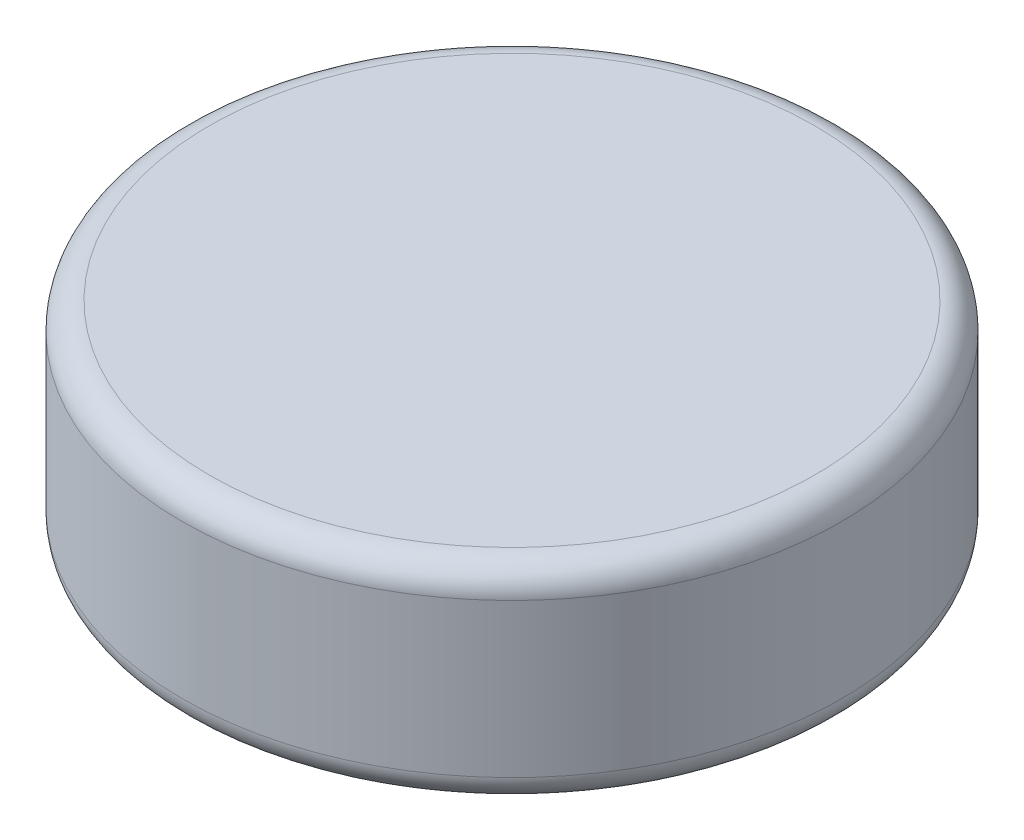
ISO-10303-21;
HEADER;
FILE_DESCRIPTION(('STEP AP214'),'2;1');
FILE_NAME('part.step','',(''),(''),'','','');
FILE_SCHEMA(('AUTOMOTIVE_DESIGN { 1 0 10303 214 1 1 1 1 }'));
ENDSEC;
DATA;
#1=APPLICATION_CONTEXT('core data for automotive mechanical design processes');
#2=APPLICATION_PROTOCOL_DEFINITION('international standard','automotive_design',2000,#1);
#3=PRODUCT_CONTEXT('',#1,'mechanical');
#4=PRODUCT('Part','Part','',(#3));
#5=PRODUCT_RELATED_PRODUCT_CATEGORY('part','',(#4));
#6=PRODUCT_DEFINITION_FORMATION('','',#4);
#7=PRODUCT_DEFINITION_CONTEXT('part definition',#1,'design');
#8=PRODUCT_DEFINITION('design','',#6,#7);
#9=PRODUCT_DEFINITION_SHAPE('','',#8);
#10=(LENGTH_UNIT() NAMED_UNIT(*) SI_UNIT(.MILLI.,.METRE.));
#11=(NAMED_UNIT(*) PLANE_ANGLE_UNIT() SI_UNIT($,.RADIAN.));
#12=(NAMED_UNIT(*) SI_UNIT($,.STERADIAN.) SOLID_ANGLE_UNIT());
#13=UNCERTAINTY_MEASURE_WITH_UNIT(LENGTH_MEASURE(1.E-05),#10,'distance_accuracy_value','');
#14=(GEOMETRIC_REPRESENTATION_CONTEXT(3) GLOBAL_UNCERTAINTY_ASSIGNED_CONTEXT((#13)) GLOBAL_UNIT_ASSIGNED_CONTEXT((#10,
#11,#12)) REPRESENTATION_CONTEXT('',''));
#15=CARTESIAN_POINT('',(0.,0.,0.));
#16=DIRECTION('',(0.,0.,1.));
#17=DIRECTION('',(1.,0.,0.));
#18=AXIS2_PLACEMENT_3D('',#15,#16,#17);
#19=CARTESIAN_POINT('',(0.,7.7,0.));
#20=DIRECTION('',(0.,-1.,0.));
#21=DIRECTION('',(0.,0.,-1.));
#22=AXIS2_PLACEMENT_3D('',#19,#20,#21);
#23=CYLINDRICAL_SURFACE('',#22,12.25);
#24=CARTESIAN_POINT('',(0.,1.,0.));
#25=DIRECTION('',(0.,1.,0.));
#26=DIRECTION('',(0.,0.,1.));
#27=AXIS2_PLACEMENT_3D('',#24,#25,#26);
#28=CIRCLE('',#27,12.25);
#29=CARTESIAN_POINT('',(0.,0.999999999999997,-12.25));
#30=VERTEX_POINT('',#29);
#31=EDGE_CURVE('E43',#30,#30,#28,.T.);
#32=CARTESIAN_POINT('',(0.,6.7,0.));
#33=DIRECTION('',(0.,1.,0.));
#34=DIRECTION('',(0.,0.,1.));
#35=AXIS2_PLACEMENT_3D('',#32,#33,#34);
#36=CIRCLE('',#35,12.25);
#37=CARTESIAN_POINT('',(0.,6.7,-12.25));
#38=VERTEX_POINT('',#37);
#39=EDGE_CURVE('E47',#38,#38,#36,.F.);
#40=CARTESIAN_POINT('',(0.,0.999999999999997,-12.25));
#41=CARTESIAN_POINT('',(0.,1.059375,-12.25));
#42=CARTESIAN_POINT('',(0.,1.11875,-12.25));
#43=CARTESIAN_POINT('',(0.,1.2375,-12.25));
#44=CARTESIAN_POINT('',(0.,1.296875,-12.25));
#45=CARTESIAN_POINT('',(0.,1.415625,-12.25));
#46=CARTESIAN_POINT('',(0.,1.475,-12.25));
#47=CARTESIAN_POINT('',(0.,1.59375,-12.25));
#48=CARTESIAN_POINT('',(0.,1.653125,-12.25));
#49=CARTESIAN_POINT('',(0.,1.771875,-12.25));
#50=CARTESIAN_POINT('',(0.,1.83125,-12.25));
#51=CARTESIAN_POINT('',(0.,1.95,-12.25));
#52=CARTESIAN_POINT('',(0.,2.009375,-12.25));
#53=CARTESIAN_POINT('',(0.,2.128125,-12.25));
#54=CARTESIAN_POINT('',(0.,2.1875,-12.25));
#55=CARTESIAN_POINT('',(0.,2.30625,-12.25));
#56=CARTESIAN_POINT('',(0.,2.365625,-12.25));
#57=CARTESIAN_POINT('',(0.,2.484375,-12.25));
#58=CARTESIAN_POINT('',(0.,2.54375,-12.25));
#59=CARTESIAN_POINT('',(0.,2.6625,-12.25));
#60=CARTESIAN_POINT('',(0.,2.721875,-12.25));
#61=CARTESIAN_POINT('',(0.,2.840625,-12.25));
#62=CARTESIAN_POINT('',(0.,2.9,-12.25));
#63=CARTESIAN_POINT('',(0.,3.01875,-12.25));
#64=CARTESIAN_POINT('',(0.,3.078125,-12.25));
#65=CARTESIAN_POINT('',(0.,3.196875,-12.25));
#66=CARTESIAN_POINT('',(0.,3.25625,-12.25));
#67=CARTESIAN_POINT('',(0.,3.375,-12.25));
#68=CARTESIAN_POINT('',(0.,3.434375,-12.25));
#69=CARTESIAN_POINT('',(0.,3.553125,-12.25));
#70=CARTESIAN_POINT('',(0.,3.6125,-12.25));
#71=CARTESIAN_POINT('',(0.,3.73125,-12.25));
#72=CARTESIAN_POINT('',(0.,3.790625,-12.25));
#73=CARTESIAN_POINT('',(0.,3.909375,-12.25));
#74=CARTESIAN_POINT('',(0.,3.96875,-12.25));
#75=CARTESIAN_POINT('',(0.,4.0875,-12.25));
#76=CARTESIAN_POINT('',(0.,4.146875,-12.25));
#77=CARTESIAN_POINT('',(0.,4.265625,-12.25));
#78=CARTESIAN_POINT('',(0.,4.325,-12.25));
#79=CARTESIAN_POINT('',(0.,4.44375,-12.25));
#80=CARTESIAN_POINT('',(0.,4.503125,-12.25));
#81=CARTESIAN_POINT('',(0.,4.621875,-12.25));
#82=CARTESIAN_POINT('',(0.,4.68125,-12.25));
#83=CARTESIAN_POINT('',(0.,4.8,-12.25));
#84=CARTESIAN_POINT('',(0.,4.859375,-12.25));
#85=CARTESIAN_POINT('',(0.,4.978125,-12.25));
#86=CARTESIAN_POINT('',(0.,5.0375,-12.25));
#87=CARTESIAN_POINT('',(0.,5.15625,-12.25));
#88=CARTESIAN_POINT('',(0.,5.215625,-12.25));
#89=CARTESIAN_POINT('',(0.,5.334375,-12.25));
#90=CARTESIAN_POINT('',(0.,5.39375,-12.25));
#91=CARTESIAN_POINT('',(0.,5.5125,-12.25));
#92=CARTESIAN_POINT('',(0.,5.571875,-12.25));
#93=CARTESIAN_POINT('',(0.,5.690625,-12.25));
#94=CARTESIAN_POINT('',(0.,5.75,-12.25));
#95=CARTESIAN_POINT('',(0.,5.86875,-12.25));
#96=CARTESIAN_POINT('',(0.,5.928125,-12.25));
#97=CARTESIAN_POINT('',(0.,6.046875,-12.25));
#98=CARTESIAN_POINT('',(0.,6.10625,-12.25));
#99=CARTESIAN_POINT('',(0.,6.225,-12.25));
#100=CARTESIAN_POINT('',(0.,6.284375,-12.25));
#101=CARTESIAN_POINT('',(0.,6.403125,-12.25));
#102=CARTESIAN_POINT('',(0.,6.4625,-12.25));
#103=CARTESIAN_POINT('',(0.,6.58125,-12.25));
#104=CARTESIAN_POINT('',(0.,6.640625,-12.25));
#105=CARTESIAN_POINT('',(0.,6.7,-12.25));
#106=B_SPLINE_CURVE_WITH_KNOTS('',3,(#40,#41,#42,#43,#44,#45,#46,#47,#48,#49,#50,#51,#52,#53,
#54,#55,#56,#57,#58,#59,#60,#61,#62,#63,#64,#65,#66,#67,#68,#69,#70,#71,#72,#73,#74,#75,#76,#77,
#78,#79,#80,#81,#82,#83,#84,#85,#86,#87,#88,#89,#90,#91,#92,#93,#94,#95,#96,#97,#98,#99,#100,
#101,#102,#103,#104,#105),.UNSPECIFIED.,.F.,.F.,(4,2,2,2,2,2,2,2,2,2,2,2,2,2,2,2,2,2,2,2,2,2,2,
2,2,2,2,2,2,2,2,2,4),(0.,0.178125,0.35625,0.534375,0.7125,0.890625,1.06875,1.246875,1.425,
1.603125,1.78125,1.959375,2.1375,2.315625,2.49375,2.671875,2.85,3.028125,3.20625,3.384375,
3.5625,3.740625,3.91875,4.096875,4.275,4.453125,4.63125,4.809375,4.9875,5.165625,5.34375,
5.521875,5.7),.UNSPECIFIED.);
#107=EDGE_CURVE('BSEAM32',#30,#38,#106,.T.);
#108=ORIENTED_EDGE('',*,*,#31,.T.);
#109=ORIENTED_EDGE('',*,*,#39,.T.);
#110=ORIENTED_EDGE('',*,*,#107,.T.);
#111=ORIENTED_EDGE('',*,*,#107,.F.);
#112=EDGE_LOOP('',(#108,#110,#109,#111));
#113=FACE_BOUND('',#112,.T.);
#114=ADVANCED_FACE('F32',(#113),#23,.T.);
#115=CARTESIAN_POINT('',(0.,7.7,0.));
#116=DIRECTION('',(0.,1.,0.));
#117=DIRECTION('',(0.,0.,1.));
#118=AXIS2_PLACEMENT_3D('',#115,#116,#117);
#119=PLANE('',#118);
#120=CARTESIAN_POINT('',(0.,7.7,0.));
#121=DIRECTION('',(0.,1.,0.));
#122=DIRECTION('',(0.,0.,1.));
#123=AXIS2_PLACEMENT_3D('',#120,#121,#122);
#124=CIRCLE('',#123,11.25);
#125=CARTESIAN_POINT('',(0.,7.7,11.25));
#126=VERTEX_POINT('',#125);
#127=EDGE_CURVE('E10',#126,#126,#124,.T.);
#128=ORIENTED_EDGE('',*,*,#127,.T.);
#129=EDGE_LOOP('',(#128));
#130=FACE_BOUND('',#129,.T.);
#131=ADVANCED_FACE('F63',(#130),#119,.T.);
#132=CARTESIAN_POINT('',(0.,0.,0.));
#133=DIRECTION('',(0.,1.,0.));
#134=DIRECTION('',(0.,0.,1.));
#135=AXIS2_PLACEMENT_3D('',#132,#133,#134);
#136=PLANE('',#135);
#137=CARTESIAN_POINT('',(0.,0.,0.));
#138=DIRECTION('',(0.,1.,0.));
#139=DIRECTION('',(0.,0.,1.));
#140=AXIS2_PLACEMENT_3D('',#137,#138,#139);
#141=CIRCLE('',#140,11.25);
#142=CARTESIAN_POINT('',(0.,0.,11.25));
#143=VERTEX_POINT('',#142);
#144=EDGE_CURVE('E39',#143,#143,#141,.F.);
#145=ORIENTED_EDGE('',*,*,#144,.T.);
#146=EDGE_LOOP('',(#145));
#147=FACE_BOUND('',#146,.T.);
#148=ADVANCED_FACE('F60',(#147),#136,.F.);
#149=CARTESIAN_POINT('',(0.,1.,0.));
#150=DIRECTION('',(0.,1.,0.));
#151=DIRECTION('',(0.,0.,1.));
#152=AXIS2_PLACEMENT_3D('',#149,#150,#151);
#153=TOROIDAL_SURFACE('',#152,11.25,1.);
#154=ORIENTED_EDGE('',*,*,#144,.F.);
#155=EDGE_LOOP('',(#154));
#156=FACE_BOUND('',#155,.T.);
#157=ORIENTED_EDGE('',*,*,#31,.F.);
#158=EDGE_LOOP('',(#157));
#159=FACE_BOUND('',#158,.T.);
#160=ADVANCED_FACE('F56',(#156,#159),#153,.T.);
#161=CARTESIAN_POINT('',(0.,6.7,0.));
#162=DIRECTION('',(0.,1.,0.));
#163=DIRECTION('',(0.,0.,1.));
#164=AXIS2_PLACEMENT_3D('',#161,#162,#163);
#165=TOROIDAL_SURFACE('',#164,11.25,1.);
#166=ORIENTED_EDGE('',*,*,#39,.F.);
#167=EDGE_LOOP('',(#166));
#168=FACE_BOUND('',#167,.T.);
#169=ORIENTED_EDGE('',*,*,#127,.F.);
#170=EDGE_LOOP('',(#169));
#171=FACE_BOUND('',#170,.T.);
#172=ADVANCED_FACE('F34',(#168,#171),#165,.T.);
#173=CLOSED_SHELL('',(#114,#131,#148,#160,#172));
#174=MANIFOLD_SOLID_BREP('B2',#173);
#175=ADVANCED_BREP_SHAPE_REPRESENTATION('',(#18,#174),#14);
#176=SHAPE_DEFINITION_REPRESENTATION(#9,#175);
ENDSEC;
END-ISO-10303-21;
